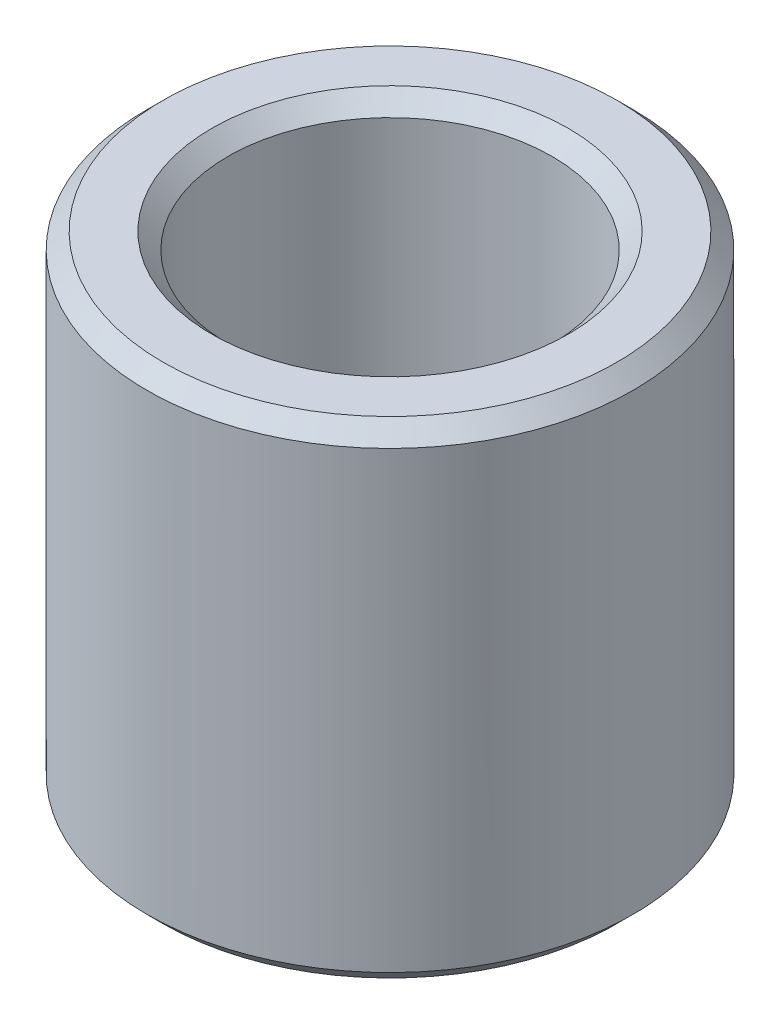
ISO-10303-21;
HEADER;
FILE_DESCRIPTION(('STEP AP214'),'2;1');
FILE_NAME('part.step','',(''),(''),'','','');
FILE_SCHEMA(('AUTOMOTIVE_DESIGN { 1 0 10303 214 1 1 1 1 }'));
ENDSEC;
DATA;
#1=APPLICATION_CONTEXT('core data for automotive mechanical design processes');
#2=APPLICATION_PROTOCOL_DEFINITION('international standard','automotive_design',2000,#1);
#3=PRODUCT_CONTEXT('',#1,'mechanical');
#4=PRODUCT('Part','Part','',(#3));
#5=PRODUCT_RELATED_PRODUCT_CATEGORY('part','',(#4));
#6=PRODUCT_DEFINITION_FORMATION('','',#4);
#7=PRODUCT_DEFINITION_CONTEXT('part definition',#1,'design');
#8=PRODUCT_DEFINITION('design','',#6,#7);
#9=PRODUCT_DEFINITION_SHAPE('','',#8);
#10=(LENGTH_UNIT() NAMED_UNIT(*) SI_UNIT(.MILLI.,.METRE.));
#11=(NAMED_UNIT(*) PLANE_ANGLE_UNIT() SI_UNIT($,.RADIAN.));
#12=(NAMED_UNIT(*) SI_UNIT($,.STERADIAN.) SOLID_ANGLE_UNIT());
#13=UNCERTAINTY_MEASURE_WITH_UNIT(LENGTH_MEASURE(1.E-05),#10,'distance_accuracy_value','');
#14=(GEOMETRIC_REPRESENTATION_CONTEXT(3) GLOBAL_UNCERTAINTY_ASSIGNED_CONTEXT((#13)) GLOBAL_UNIT_ASSIGNED_CONTEXT((#10,
#11,#12)) REPRESENTATION_CONTEXT('',''));
#15=CARTESIAN_POINT('',(0.,0.,0.));
#16=DIRECTION('',(0.,0.,1.));
#17=DIRECTION('',(1.,0.,0.));
#18=AXIS2_PLACEMENT_3D('',#15,#16,#17);
#19=CARTESIAN_POINT('',(0.,0.,0.));
#20=DIRECTION('',(0.,-1.,0.));
#21=DIRECTION('',(0.,0.,-1.));
#22=AXIS2_PLACEMENT_3D('',#19,#20,#21);
#23=CYLINDRICAL_SURFACE('',#22,2.);
#24=CARTESIAN_POINT('',(0.,-2.8,0.));
#25=DIRECTION('',(0.,1.,0.));
#26=DIRECTION('',(0.,0.,1.));
#27=AXIS2_PLACEMENT_3D('',#24,#25,#26);
#28=CIRCLE('',#27,2.);
#29=CARTESIAN_POINT('',(0.,-2.8,-2.));
#30=VERTEX_POINT('',#29);
#31=EDGE_CURVE('E61',#30,#30,#28,.F.);
#32=ORIENTED_EDGE('',*,*,#31,.T.);
#33=EDGE_LOOP('',(#32));
#34=FACE_BOUND('',#33,.T.);
#35=CARTESIAN_POINT('',(0.,2.8,0.));
#36=DIRECTION('',(0.,-1.,0.));
#37=DIRECTION('',(0.,0.,-1.));
#38=AXIS2_PLACEMENT_3D('',#35,#36,#37);
#39=CIRCLE('',#38,2.);
#40=CARTESIAN_POINT('',(0.,2.8,-2.));
#41=VERTEX_POINT('',#40);
#42=EDGE_CURVE('E64',#41,#41,#39,.F.);
#43=ORIENTED_EDGE('',*,*,#42,.T.);
#44=EDGE_LOOP('',(#43));
#45=FACE_BOUND('',#44,.T.);
#46=ADVANCED_FACE('F34',(#34,#45),#23,.F.);
#47=CARTESIAN_POINT('',(-3.,-3.,0.));
#48=DIRECTION('',(0.,1.,0.));
#49=DIRECTION('',(0.,0.,1.));
#50=AXIS2_PLACEMENT_3D('',#47,#48,#49);
#51=PLANE('',#50);
#52=CARTESIAN_POINT('',(0.,-3.,0.));
#53=DIRECTION('',(0.,1.,0.));
#54=DIRECTION('',(0.,0.,1.));
#55=AXIS2_PLACEMENT_3D('',#52,#53,#54);
#56=CIRCLE('',#55,2.2);
#57=CARTESIAN_POINT('',(0.,-3.,-2.2));
#58=VERTEX_POINT('',#57);
#59=EDGE_CURVE('E55',#58,#58,#56,.T.);
#60=ORIENTED_EDGE('',*,*,#59,.T.);
#61=EDGE_LOOP('',(#60));
#62=FACE_BOUND('',#61,.T.);
#63=CARTESIAN_POINT('',(0.,-3.,0.));
#64=DIRECTION('',(0.,1.,0.));
#65=DIRECTION('',(0.,0.,1.));
#66=AXIS2_PLACEMENT_3D('',#63,#64,#65);
#67=CIRCLE('',#66,2.8);
#68=CARTESIAN_POINT('',(0.,-3.,2.8));
#69=VERTEX_POINT('',#68);
#70=EDGE_CURVE('E58',#69,#69,#67,.F.);
#71=ORIENTED_EDGE('',*,*,#70,.T.);
#72=EDGE_LOOP('',(#71));
#73=FACE_BOUND('',#72,.T.);
#74=ADVANCED_FACE('F92',(#62,#73),#51,.F.);
#75=CARTESIAN_POINT('',(0.,0.,0.));
#76=DIRECTION('',(0.,-1.,0.));
#77=DIRECTION('',(0.,0.,-1.));
#78=AXIS2_PLACEMENT_3D('',#75,#76,#77);
#79=CYLINDRICAL_SURFACE('',#78,3.);
#80=CARTESIAN_POINT('',(0.,2.8,0.));
#81=DIRECTION('',(0.,-1.,0.));
#82=DIRECTION('',(0.,0.,-1.));
#83=AXIS2_PLACEMENT_3D('',#80,#81,#82);
#84=CIRCLE('',#83,3.);
#85=CARTESIAN_POINT('',(0.,2.8,-3.));
#86=VERTEX_POINT('',#85);
#87=EDGE_CURVE('E10',#86,#86,#84,.T.);
#88=ORIENTED_EDGE('',*,*,#87,.T.);
#89=EDGE_LOOP('',(#88));
#90=FACE_BOUND('',#89,.T.);
#91=CARTESIAN_POINT('',(0.,-2.8,0.));
#92=DIRECTION('',(0.,1.,0.));
#93=DIRECTION('',(0.,0.,1.));
#94=AXIS2_PLACEMENT_3D('',#91,#92,#93);
#95=CIRCLE('',#94,3.);
#96=CARTESIAN_POINT('',(0.,-2.8,3.));
#97=VERTEX_POINT('',#96);
#98=EDGE_CURVE('E42',#97,#97,#95,.T.);
#99=ORIENTED_EDGE('',*,*,#98,.T.);
#100=EDGE_LOOP('',(#99));
#101=FACE_BOUND('',#100,.T.);
#102=ADVANCED_FACE('F80',(#90,#101),#79,.T.);
#103=CARTESIAN_POINT('',(-3.,3.,0.));
#104=DIRECTION('',(0.,-1.,0.));
#105=DIRECTION('',(0.,0.,-1.));
#106=AXIS2_PLACEMENT_3D('',#103,#104,#105);
#107=PLANE('',#106);
#108=CARTESIAN_POINT('',(0.,3.,0.));
#109=DIRECTION('',(0.,-1.,0.));
#110=DIRECTION('',(0.,0.,-1.));
#111=AXIS2_PLACEMENT_3D('',#108,#109,#110);
#112=CIRCLE('',#111,2.2);
#113=CARTESIAN_POINT('',(0.,3.,-2.2));
#114=VERTEX_POINT('',#113);
#115=EDGE_CURVE('E46',#114,#114,#112,.T.);
#116=ORIENTED_EDGE('',*,*,#115,.T.);
#117=EDGE_LOOP('',(#116));
#118=FACE_BOUND('',#117,.T.);
#119=CARTESIAN_POINT('',(0.,3.,0.));
#120=DIRECTION('',(0.,-1.,0.));
#121=DIRECTION('',(0.,0.,-1.));
#122=AXIS2_PLACEMENT_3D('',#119,#120,#121);
#123=CIRCLE('',#122,2.8);
#124=CARTESIAN_POINT('',(0.,3.,-2.8));
#125=VERTEX_POINT('',#124);
#126=EDGE_CURVE('E50',#125,#125,#123,.F.);
#127=ORIENTED_EDGE('',*,*,#126,.T.);
#128=EDGE_LOOP('',(#127));
#129=FACE_BOUND('',#128,.T.);
#130=ADVANCED_FACE('F77',(#118,#129),#107,.F.);
#131=CARTESIAN_POINT('',(0.,-2.8,0.));
#132=DIRECTION('',(0.,-1.,0.));
#133=DIRECTION('',(0.,0.,-1.));
#134=AXIS2_PLACEMENT_3D('',#131,#132,#133);
#135=CONICAL_SURFACE('',#134,2.,0.785398163397453);
#136=CARTESIAN_POINT('',(0.,-3.,-2.2));
#137=CARTESIAN_POINT('',(0.,-2.99791666666667,-2.19791666666667));
#138=CARTESIAN_POINT('',(0.,-2.99583333333333,-2.19583333333333));
#139=CARTESIAN_POINT('',(0.,-2.99166666666667,-2.19166666666667));
#140=CARTESIAN_POINT('',(0.,-2.98958333333333,-2.18958333333333));
#141=CARTESIAN_POINT('',(0.,-2.98541666666667,-2.18541666666667));
#142=CARTESIAN_POINT('',(0.,-2.98333333333333,-2.18333333333333));
#143=CARTESIAN_POINT('',(0.,-2.97916666666667,-2.17916666666667));
#144=CARTESIAN_POINT('',(0.,-2.97708333333333,-2.17708333333333));
#145=CARTESIAN_POINT('',(0.,-2.97291666666667,-2.17291666666667));
#146=CARTESIAN_POINT('',(0.,-2.97083333333333,-2.17083333333333));
#147=CARTESIAN_POINT('',(0.,-2.96666666666667,-2.16666666666667));
#148=CARTESIAN_POINT('',(0.,-2.96458333333333,-2.16458333333333));
#149=CARTESIAN_POINT('',(0.,-2.96041666666667,-2.16041666666667));
#150=CARTESIAN_POINT('',(0.,-2.95833333333333,-2.15833333333333));
#151=CARTESIAN_POINT('',(0.,-2.95416666666667,-2.15416666666667));
#152=CARTESIAN_POINT('',(0.,-2.95208333333333,-2.15208333333333));
#153=CARTESIAN_POINT('',(0.,-2.94791666666667,-2.14791666666667));
#154=CARTESIAN_POINT('',(0.,-2.94583333333333,-2.14583333333333));
#155=CARTESIAN_POINT('',(0.,-2.94166666666667,-2.14166666666667));
#156=CARTESIAN_POINT('',(0.,-2.93958333333333,-2.13958333333333));
#157=CARTESIAN_POINT('',(0.,-2.93541666666667,-2.13541666666667));
#158=CARTESIAN_POINT('',(0.,-2.93333333333333,-2.13333333333333));
#159=CARTESIAN_POINT('',(0.,-2.92916666666667,-2.12916666666667));
#160=CARTESIAN_POINT('',(0.,-2.92708333333333,-2.12708333333333));
#161=CARTESIAN_POINT('',(0.,-2.92291666666667,-2.12291666666667));
#162=CARTESIAN_POINT('',(0.,-2.92083333333333,-2.12083333333333));
#163=CARTESIAN_POINT('',(0.,-2.91666666666667,-2.11666666666667));
#164=CARTESIAN_POINT('',(0.,-2.91458333333333,-2.11458333333333));
#165=CARTESIAN_POINT('',(0.,-2.91041666666667,-2.11041666666667));
#166=CARTESIAN_POINT('',(0.,-2.90833333333333,-2.10833333333333));
#167=CARTESIAN_POINT('',(0.,-2.90416666666667,-2.10416666666667));
#168=CARTESIAN_POINT('',(0.,-2.90208333333333,-2.10208333333333));
#169=CARTESIAN_POINT('',(0.,-2.89791666666667,-2.09791666666667));
#170=CARTESIAN_POINT('',(0.,-2.89583333333333,-2.09583333333333));
#171=CARTESIAN_POINT('',(0.,-2.89166666666667,-2.09166666666667));
#172=CARTESIAN_POINT('',(0.,-2.88958333333333,-2.08958333333333));
#173=CARTESIAN_POINT('',(0.,-2.88541666666667,-2.08541666666667));
#174=CARTESIAN_POINT('',(0.,-2.88333333333333,-2.08333333333333));
#175=CARTESIAN_POINT('',(0.,-2.87916666666667,-2.07916666666667));
#176=CARTESIAN_POINT('',(0.,-2.87708333333333,-2.07708333333333));
#177=CARTESIAN_POINT('',(0.,-2.87291666666667,-2.07291666666667));
#178=CARTESIAN_POINT('',(0.,-2.87083333333333,-2.07083333333333));
#179=CARTESIAN_POINT('',(0.,-2.86666666666667,-2.06666666666667));
#180=CARTESIAN_POINT('',(0.,-2.86458333333333,-2.06458333333333));
#181=CARTESIAN_POINT('',(0.,-2.86041666666667,-2.06041666666667));
#182=CARTESIAN_POINT('',(0.,-2.85833333333333,-2.05833333333333));
#183=CARTESIAN_POINT('',(0.,-2.85416666666667,-2.05416666666667));
#184=CARTESIAN_POINT('',(0.,-2.85208333333333,-2.05208333333333));
#185=CARTESIAN_POINT('',(0.,-2.84791666666667,-2.04791666666667));
#186=CARTESIAN_POINT('',(0.,-2.84583333333333,-2.04583333333333));
#187=CARTESIAN_POINT('',(0.,-2.84166666666667,-2.04166666666667));
#188=CARTESIAN_POINT('',(0.,-2.83958333333333,-2.03958333333333));
#189=CARTESIAN_POINT('',(0.,-2.83541666666667,-2.03541666666667));
#190=CARTESIAN_POINT('',(0.,-2.83333333333333,-2.03333333333333));
#191=CARTESIAN_POINT('',(0.,-2.82916666666667,-2.02916666666667));
#192=CARTESIAN_POINT('',(0.,-2.82708333333333,-2.02708333333333));
#193=CARTESIAN_POINT('',(0.,-2.82291666666667,-2.02291666666667));
#194=CARTESIAN_POINT('',(0.,-2.82083333333333,-2.02083333333333));
#195=CARTESIAN_POINT('',(0.,-2.81666666666667,-2.01666666666667));
#196=CARTESIAN_POINT('',(0.,-2.81458333333333,-2.01458333333333));
#197=CARTESIAN_POINT('',(0.,-2.81041666666667,-2.01041666666667));
#198=CARTESIAN_POINT('',(0.,-2.80833333333333,-2.00833333333333));
#199=CARTESIAN_POINT('',(0.,-2.80416666666667,-2.00416666666667));
#200=CARTESIAN_POINT('',(0.,-2.80208333333333,-2.00208333333333));
#201=CARTESIAN_POINT('',(0.,-2.8,-2.));
#202=B_SPLINE_CURVE_WITH_KNOTS('',3,(#136,#137,#138,#139,#140,#141,#142,#143,#144,#145,#146,
#147,#148,#149,#150,#151,#152,#153,#154,#155,#156,#157,#158,#159,#160,#161,#162,#163,#164,#165,
#166,#167,#168,#169,#170,#171,#172,#173,#174,#175,#176,#177,#178,#179,#180,#181,#182,#183,#184,
#185,#186,#187,#188,#189,#190,#191,#192,#193,#194,#195,#196,#197,#198,#199,#200,#201),
.UNSPECIFIED.,.F.,.F.,(4,2,2,2,2,2,2,2,2,2,2,2,2,2,2,2,2,2,2,2,2,2,2,2,2,2,2,2,2,2,2,2,4),(0.,
0.0088388347648321,0.0176776695296642,0.0265165042944957,0.0353553390593278,0.0441941738241596,
0.0530330085889914,0.0618718433538231,0.0707106781186552,0.0795495128834873,0.0883883476483188,
0.0972271824131509,0.106066017177983,0.114904851942815,0.123743686707646,0.132582521472478,
0.14142135623731,0.150260191002142,0.159099025766974,0.167937860531806,0.176776695296638,
0.185615530061469,0.194454364826302,0.203293199591133,0.212132034355965,0.220970869120797,
0.229809703885629,0.238648538650461,0.247487373415293,0.256326208180124,0.265165042944956,
0.274003877709788,0.28284271247462),.UNSPECIFIED.);
#203=EDGE_CURVE('BSEAM73',#58,#30,#202,.T.);
#204=ORIENTED_EDGE('',*,*,#59,.F.);
#205=ORIENTED_EDGE('',*,*,#31,.F.);
#206=ORIENTED_EDGE('',*,*,#203,.T.);
#207=ORIENTED_EDGE('',*,*,#203,.F.);
#208=EDGE_LOOP('',(#204,#206,#205,#207));
#209=FACE_BOUND('',#208,.T.);
#210=ADVANCED_FACE('F73',(#209),#135,.F.);
#211=CARTESIAN_POINT('',(0.,3.,0.));
#212=DIRECTION('',(0.,1.,0.));
#213=DIRECTION('',(0.,0.,1.));
#214=AXIS2_PLACEMENT_3D('',#211,#212,#213);
#215=CONICAL_SURFACE('',#214,2.2,0.785398163397446);
#216=ORIENTED_EDGE('',*,*,#42,.F.);
#217=EDGE_LOOP('',(#216));
#218=FACE_BOUND('',#217,.T.);
#219=ORIENTED_EDGE('',*,*,#115,.F.);
#220=EDGE_LOOP('',(#219));
#221=FACE_BOUND('',#220,.T.);
#222=ADVANCED_FACE('F69',(#218,#221),#215,.F.);
#223=CARTESIAN_POINT('',(0.,2.8,0.));
#224=DIRECTION('',(0.,-1.,0.));
#225=DIRECTION('',(0.,0.,-1.));
#226=AXIS2_PLACEMENT_3D('',#223,#224,#225);
#227=CONICAL_SURFACE('',#226,3.,0.785398163397449);
#228=ORIENTED_EDGE('',*,*,#126,.F.);
#229=EDGE_LOOP('',(#228));
#230=FACE_BOUND('',#229,.T.);
#231=ORIENTED_EDGE('',*,*,#87,.F.);
#232=EDGE_LOOP('',(#231));
#233=FACE_BOUND('',#232,.T.);
#234=ADVANCED_FACE('F72',(#230,#233),#227,.T.);
#235=CARTESIAN_POINT('',(0.,-3.,0.));
#236=DIRECTION('',(0.,1.,0.));
#237=DIRECTION('',(0.,0.,1.));
#238=AXIS2_PLACEMENT_3D('',#235,#236,#237);
#239=CONICAL_SURFACE('',#238,2.8,0.785398163397447);
#240=ORIENTED_EDGE('',*,*,#98,.F.);
#241=EDGE_LOOP('',(#240));
#242=FACE_BOUND('',#241,.T.);
#243=ORIENTED_EDGE('',*,*,#70,.F.);
#244=EDGE_LOOP('',(#243));
#245=FACE_BOUND('',#244,.T.);
#246=ADVANCED_FACE('F37',(#242,#245),#239,.T.);
#247=CLOSED_SHELL('',(#46,#74,#102,#130,#210,#222,#234,#246));
#248=MANIFOLD_SOLID_BREP('B2',#247);
#249=ADVANCED_BREP_SHAPE_REPRESENTATION('',(#18,#248),#14);
#250=SHAPE_DEFINITION_REPRESENTATION(#9,#249);
ENDSEC;
END-ISO-10303-21;
